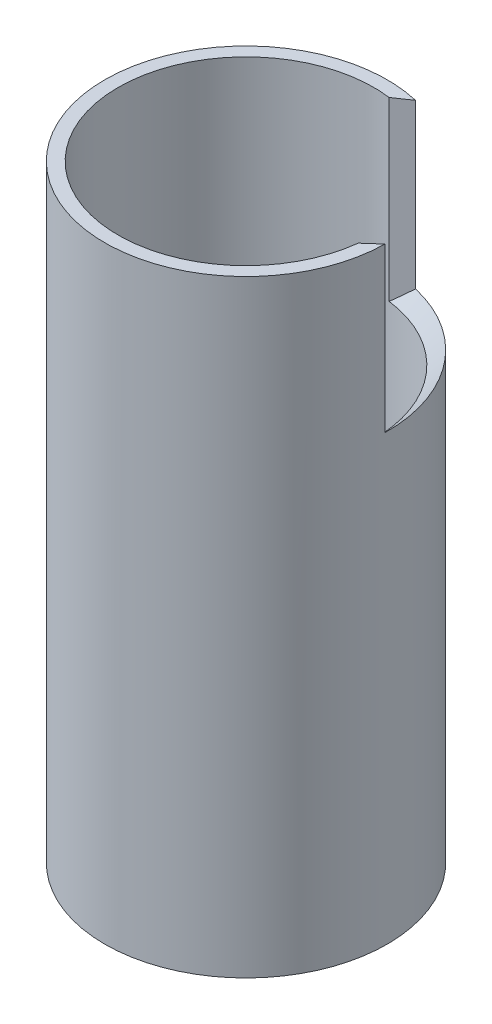
ISO-10303-21;
HEADER;
FILE_DESCRIPTION(('STEP AP214'),'2;1');
FILE_NAME('part.step','',(''),(''),'','','');
FILE_SCHEMA(('AUTOMOTIVE_DESIGN { 1 0 10303 214 1 1 1 1 }'));
ENDSEC;
DATA;
#1=APPLICATION_CONTEXT('core data for automotive mechanical design processes');
#2=APPLICATION_PROTOCOL_DEFINITION('international standard','automotive_design',2000,#1);
#3=PRODUCT_CONTEXT('',#1,'mechanical');
#4=PRODUCT('Part','Part','',(#3));
#5=PRODUCT_RELATED_PRODUCT_CATEGORY('part','',(#4));
#6=PRODUCT_DEFINITION_FORMATION('','',#4);
#7=PRODUCT_DEFINITION_CONTEXT('part definition',#1,'design');
#8=PRODUCT_DEFINITION('design','',#6,#7);
#9=PRODUCT_DEFINITION_SHAPE('','',#8);
#10=(LENGTH_UNIT() NAMED_UNIT(*) SI_UNIT(.MILLI.,.METRE.));
#11=(NAMED_UNIT(*) PLANE_ANGLE_UNIT() SI_UNIT($,.RADIAN.));
#12=(NAMED_UNIT(*) SI_UNIT($,.STERADIAN.) SOLID_ANGLE_UNIT());
#13=UNCERTAINTY_MEASURE_WITH_UNIT(LENGTH_MEASURE(1.E-05),#10,'distance_accuracy_value','');
#14=(GEOMETRIC_REPRESENTATION_CONTEXT(3) GLOBAL_UNCERTAINTY_ASSIGNED_CONTEXT((#13)) GLOBAL_UNIT_ASSIGNED_CONTEXT((#10,
#11,#12)) REPRESENTATION_CONTEXT('',''));
#15=CARTESIAN_POINT('',(0.,0.,0.));
#16=DIRECTION('',(0.,0.,1.));
#17=DIRECTION('',(1.,0.,0.));
#18=AXIS2_PLACEMENT_3D('',#15,#16,#17);
#19=CARTESIAN_POINT('',(0.,180.975,0.));
#20=DIRECTION('',(0.,1.,0.));
#21=DIRECTION('',(0.,0.,1.));
#22=AXIS2_PLACEMENT_3D('',#19,#20,#21);
#23=PLANE('',#22);
#24=CARTESIAN_POINT('',(0.,180.975,0.));
#25=DIRECTION('',(0.,1.,0.));
#26=DIRECTION('',(0.,0.,1.));
#27=AXIS2_PLACEMENT_3D('',#24,#25,#26);
#28=CIRCLE('',#27,84.1375);
#29=CARTESIAN_POINT('',(19.0646397860755,180.975,-81.9491208987454));
#30=VERTEX_POINT('',#29);
#31=CARTESIAN_POINT('',(84.1270355760998,180.975,1.32694816313077));
#32=VERTEX_POINT('',#31);
#33=EDGE_CURVE('E92',#30,#32,#28,.T.);
#34=ORIENTED_EDGE('',*,*,#33,.T.);
#35=DIRECTION('',(-0.746997081902761,0.,0.66482731564577));
#36=VECTOR('',#35,1.);
#37=CARTESIAN_POINT('',(37.8427537344551,180.975,42.5199535962879));
#38=LINE('',#37,#36);
#39=CARTESIAN_POINT('',(75.6855074689114,180.975,8.83990719257572));
#40=VERTEX_POINT('',#39);
#41=EDGE_CURVE('E99',#32,#40,#38,.T.);
#42=ORIENTED_EDGE('',*,*,#41,.T.);
#43=CARTESIAN_POINT('',(0.,180.975,0.));
#44=DIRECTION('',(0.,1.,0.));
#45=DIRECTION('',(0.,0.,1.));
#46=AXIS2_PLACEMENT_3D('',#43,#44,#45);
#47=CIRCLE('',#46,76.2);
#48=CARTESIAN_POINT('',(9.7326572666695,180.975,-75.5758915430678));
#49=VERTEX_POINT('',#48);
#50=EDGE_CURVE('E95',#49,#40,#47,.T.);
#51=ORIENTED_EDGE('',*,*,#50,.F.);
#52=DIRECTION('',(-0.825794053143972,0.,0.563971791663422));
#53=VECTOR('',#52,1.);
#54=CARTESIAN_POINT('',(-32.1019385377808,180.975,-47.0051699938808));
#55=LINE('',#54,#53);
#56=EDGE_CURVE('E90',#49,#30,#55,.F.);
#57=ORIENTED_EDGE('',*,*,#56,.T.);
#58=EDGE_LOOP('',(#34,#42,#51,#57));
#59=FACE_BOUND('',#58,.T.);
#60=ADVANCED_FACE('F45',(#59),#23,.T.);
#61=CARTESIAN_POINT('',(0.,-180.975,0.));
#62=DIRECTION('',(0.,1.,0.));
#63=DIRECTION('',(0.,0.,1.));
#64=AXIS2_PLACEMENT_3D('',#61,#62,#63);
#65=PLANE('',#64);
#66=CARTESIAN_POINT('',(0.,-180.975,0.));
#67=DIRECTION('',(0.,1.,0.));
#68=DIRECTION('',(0.,0.,1.));
#69=AXIS2_PLACEMENT_3D('',#66,#67,#68);
#70=CIRCLE('',#69,84.1375);
#71=CARTESIAN_POINT('',(0.,-180.975,84.1375));
#72=VERTEX_POINT('',#71);
#73=EDGE_CURVE('E109',#72,#72,#70,.T.);
#74=ORIENTED_EDGE('',*,*,#73,.F.);
#75=EDGE_LOOP('',(#74));
#76=FACE_BOUND('',#75,.T.);
#77=CARTESIAN_POINT('',(0.,-180.975,0.));
#78=DIRECTION('',(0.,1.,0.));
#79=DIRECTION('',(0.,0.,1.));
#80=AXIS2_PLACEMENT_3D('',#77,#78,#79);
#81=CIRCLE('',#80,76.2);
#82=CARTESIAN_POINT('',(0.,-180.975,76.2));
#83=VERTEX_POINT('',#82);
#84=EDGE_CURVE('E147',#83,#83,#81,.T.);
#85=ORIENTED_EDGE('',*,*,#84,.T.);
#86=EDGE_LOOP('',(#85));
#87=FACE_BOUND('',#86,.T.);
#88=ADVANCED_FACE('F134',(#76,#87),#65,.F.);
#89=CARTESIAN_POINT('',(0.,180.975,0.));
#90=DIRECTION('',(0.,-1.,0.));
#91=DIRECTION('',(0.,0.,-1.));
#92=AXIS2_PLACEMENT_3D('',#89,#90,#91);
#93=CYLINDRICAL_SURFACE('',#92,84.1375);
#94=CARTESIAN_POINT('',(0.,83.6624999999999,0.));
#95=DIRECTION('',(0.,1.,0.));
#96=DIRECTION('',(0.,0.,1.));
#97=AXIS2_PLACEMENT_3D('',#94,#95,#96);
#98=CIRCLE('',#97,84.1375);
#99=CARTESIAN_POINT('',(19.0646397860755,83.6624999999999,-81.9491208987454));
#100=VERTEX_POINT('',#99);
#101=CARTESIAN_POINT('',(84.1270355760998,83.6624999999999,1.32694816313077));
#102=VERTEX_POINT('',#101);
#103=EDGE_CURVE('E111',#100,#102,#98,.F.);
#104=ORIENTED_EDGE('',*,*,#103,.T.);
#105=DIRECTION('',(0.,-1.,0.));
#106=VECTOR('',#105,1.);
#107=CARTESIAN_POINT('',(84.1270355760998,132.31875,1.32694816313076));
#108=LINE('',#107,#106);
#109=EDGE_CURVE('E100',#102,#32,#108,.F.);
#110=ORIENTED_EDGE('',*,*,#109,.T.);
#111=ORIENTED_EDGE('',*,*,#33,.F.);
#112=DIRECTION('',(0.,-1.,0.));
#113=VECTOR('',#112,1.);
#114=CARTESIAN_POINT('',(19.0646397860755,132.31875,-81.9491208987454));
#115=LINE('',#114,#113);
#116=EDGE_CURVE('E106',#30,#100,#115,.T.);
#117=ORIENTED_EDGE('',*,*,#116,.T.);
#118=EDGE_LOOP('',(#104,#110,#111,#117));
#119=FACE_BOUND('',#118,.T.);
#120=ORIENTED_EDGE('',*,*,#73,.T.);
#121=EDGE_LOOP('',(#120));
#122=FACE_BOUND('',#121,.T.);
#123=ADVANCED_FACE('F104',(#119,#122),#93,.T.);
#124=CARTESIAN_POINT('',(0.,180.975,0.));
#125=DIRECTION('',(0.,-1.,0.));
#126=DIRECTION('',(0.,0.,-1.));
#127=AXIS2_PLACEMENT_3D('',#124,#125,#126);
#128=CYLINDRICAL_SURFACE('',#127,76.2);
#129=ORIENTED_EDGE('',*,*,#50,.T.);
#130=DIRECTION('',(0.,-1.,0.));
#131=VECTOR('',#130,1.);
#132=CARTESIAN_POINT('',(75.6855074689114,180.975,8.83990719257572));
#133=LINE('',#132,#131);
#134=CARTESIAN_POINT('',(75.6855074689114,75.7249999999998,8.83990719257572));
#135=VERTEX_POINT('',#134);
#136=EDGE_CURVE('E120',#40,#135,#133,.T.);
#137=ORIENTED_EDGE('',*,*,#136,.T.);
#138=CARTESIAN_POINT('',(0.,75.7249999999998,0.));
#139=DIRECTION('',(0.,1.,0.));
#140=DIRECTION('',(0.,0.,1.));
#141=AXIS2_PLACEMENT_3D('',#138,#139,#140);
#142=CIRCLE('',#141,76.2);
#143=CARTESIAN_POINT('',(9.7326572666695,75.7249999999998,-75.5758915430678));
#144=VERTEX_POINT('',#143);
#145=EDGE_CURVE('E64',#135,#144,#142,.T.);
#146=ORIENTED_EDGE('',*,*,#145,.T.);
#147=DIRECTION('',(0.,-1.,0.));
#148=VECTOR('',#147,1.);
#149=CARTESIAN_POINT('',(9.7326572666695,180.975,-75.5758915430678));
#150=LINE('',#149,#148);
#151=EDGE_CURVE('E118',#144,#49,#150,.F.);
#152=ORIENTED_EDGE('',*,*,#151,.T.);
#153=EDGE_LOOP('',(#129,#137,#146,#152));
#154=FACE_BOUND('',#153,.T.);
#155=ORIENTED_EDGE('',*,*,#84,.F.);
#156=EDGE_LOOP('',(#155));
#157=FACE_BOUND('',#156,.T.);
#158=ADVANCED_FACE('F130',(#154,#157),#128,.F.);
#159=CARTESIAN_POINT('',(0.,75.7249999999998,0.));
#160=DIRECTION('',(0.,1.,0.));
#161=DIRECTION('',(0.,0.,1.));
#162=AXIS2_PLACEMENT_3D('',#159,#160,#161);
#163=CONICAL_SURFACE('',#162,76.2,0.785398163397443);
#164=ORIENTED_EDGE('',*,*,#145,.F.);
#165=CARTESIAN_POINT('',(75.6855074689114,75.7249999999998,8.83990719257572));
#166=CARTESIAN_POINT('',(76.4015092822931,76.3622810390313,8.20266566229351));
#167=CARTESIAN_POINT('',(77.1140492932955,77.0064933904989,7.56850513572462));
#168=CARTESIAN_POINT('',(78.5326231565814,78.3073470591238,6.30597456308656));
#169=CARTESIAN_POINT('',(79.2386579260109,78.9639865830918,5.67760370075768));
#170=CARTESIAN_POINT('',(80.644828572872,80.2884301457992,4.4261119892891));
#171=CARTESIAN_POINT('',(81.3449645755135,80.956233946658,3.80299102871259));
#172=CARTESIAN_POINT('',(82.7399083889881,82.3020245853618,2.56149119764664));
#173=CARTESIAN_POINT('',(83.4347154226411,82.980012867409,1.94311301884751));
#174=CARTESIAN_POINT('',(84.1270355760998,83.6624999999999,1.32694816313077));
#175=B_SPLINE_CURVE_WITH_KNOTS('',3,(#165,#166,#167,#168,#169,#170,#171,#172,#173,#174),
.UNSPECIFIED.,.F.,.F.,(4,2,2,2,4),(0.,3.45301893059635,6.90554334753621,10.3579942940463,
13.8109395228771),.UNSPECIFIED.);
#176=EDGE_CURVE('E58',#135,#102,#175,.T.);
#177=ORIENTED_EDGE('',*,*,#176,.T.);
#178=ORIENTED_EDGE('',*,*,#103,.F.);
#179=CARTESIAN_POINT('',(19.0646397860755,83.6624999999999,-81.9491208987454));
#180=CARTESIAN_POINT('',(18.2992902560055,82.980012867409,-81.4264293825265));
#181=CARTESIAN_POINT('',(17.5311915172371,82.3020245853618,-80.9018603083991));
#182=CARTESIAN_POINT('',(15.9891020853706,80.956233946658,-79.8486982803077));
#183=CARTESIAN_POINT('',(15.2151122514336,80.2884301457992,-79.3201059131032));
#184=CARTESIAN_POINT('',(13.6606117239005,78.9639865830918,-78.2584677912049));
#185=CARTESIAN_POINT('',(12.8801008918868,78.3073470591238,-77.7254219419794));
#186=CARTESIAN_POINT('',(11.311888794909,77.0064933904989,-76.6544195744114));
#187=CARTESIAN_POINT('',(10.524186516054,76.3622810390313,-76.1164623636372));
#188=CARTESIAN_POINT('',(9.7326572666695,75.7249999999998,-75.5758915430678));
#189=B_SPLINE_CURVE_WITH_KNOTS('',3,(#179,#180,#181,#182,#183,#184,#185,#186,#187,#188),
.UNSPECIFIED.,.F.,.F.,(4,2,2,2,4),(0.,3.45294522883074,6.90539617534085,10.3579205922807,
13.8109395228771),.UNSPECIFIED.);
#190=EDGE_CURVE('E13',#100,#144,#189,.T.);
#191=ORIENTED_EDGE('',*,*,#190,.T.);
#192=EDGE_LOOP('',(#164,#177,#178,#191));
#193=FACE_BOUND('',#192,.T.);
#194=ADVANCED_FACE('F126',(#193),#163,.F.);
#195=CARTESIAN_POINT('',(85.6179887640444,180.975,2.98933610038942E-13));
#196=DIRECTION('',(-0.66482731564577,0.,-0.746997081902761));
#197=DIRECTION('',(0.,-1.,0.));
#198=AXIS2_PLACEMENT_3D('',#195,#196,#197);
#199=PLANE('',#198);
#200=ORIENTED_EDGE('',*,*,#176,.F.);
#201=ORIENTED_EDGE('',*,*,#136,.F.);
#202=ORIENTED_EDGE('',*,*,#41,.F.);
#203=ORIENTED_EDGE('',*,*,#109,.F.);
#204=EDGE_LOOP('',(#200,#201,#202,#203));
#205=FACE_BOUND('',#204,.T.);
#206=ADVANCED_FACE('F124',(#205),#199,.T.);
#207=CARTESIAN_POINT('',(20.7128661392287,180.975,-83.0747685900985));
#208=DIRECTION('',(-0.563971791663422,0.,-0.825794053143972));
#209=DIRECTION('',(0.,-1.,0.));
#210=AXIS2_PLACEMENT_3D('',#207,#208,#209);
#211=PLANE('',#210);
#212=ORIENTED_EDGE('',*,*,#56,.F.);
#213=ORIENTED_EDGE('',*,*,#151,.F.);
#214=ORIENTED_EDGE('',*,*,#190,.F.);
#215=ORIENTED_EDGE('',*,*,#116,.F.);
#216=EDGE_LOOP('',(#212,#213,#214,#215));
#217=FACE_BOUND('',#216,.T.);
#218=ADVANCED_FACE('F47',(#217),#211,.F.);
#219=CLOSED_SHELL('',(#60,#88,#123,#158,#194,#206,#218));
#220=MANIFOLD_SOLID_BREP('B2',#219);
#221=ADVANCED_BREP_SHAPE_REPRESENTATION('',(#18,#220),#14);
#222=SHAPE_DEFINITION_REPRESENTATION(#9,#221);
ENDSEC;
END-ISO-10303-21;
